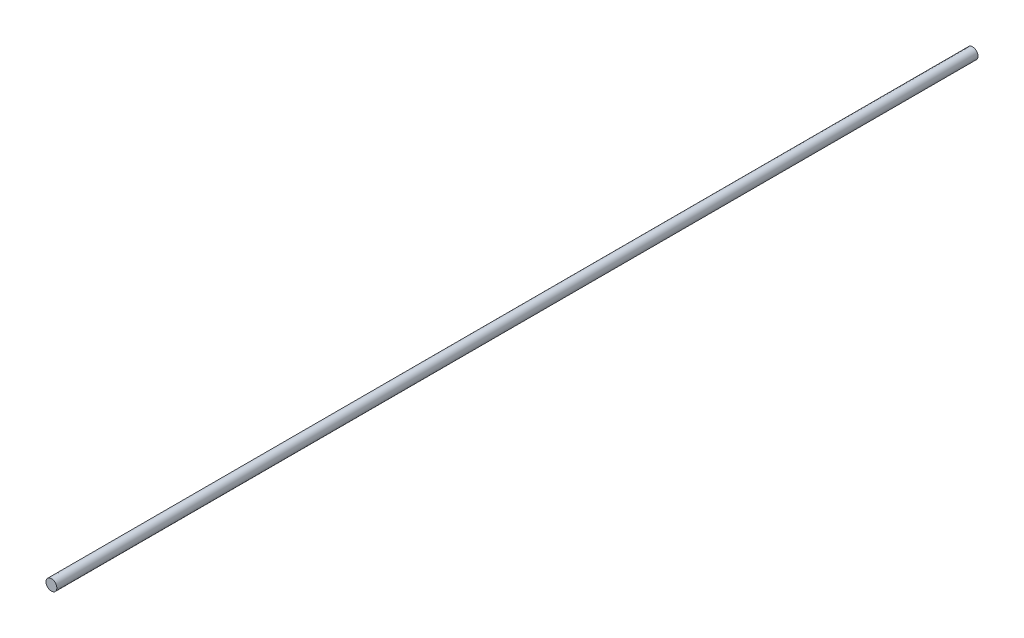
ISO-10303-21;
HEADER;
FILE_DESCRIPTION(('STEP AP214'),'2;1');
FILE_NAME('part.step','',(''),(''),'','','');
FILE_SCHEMA(('AUTOMOTIVE_DESIGN { 1 0 10303 214 1 1 1 1 }'));
ENDSEC;
DATA;
#1=APPLICATION_CONTEXT('core data for automotive mechanical design processes');
#2=APPLICATION_PROTOCOL_DEFINITION('international standard','automotive_design',2000,#1);
#3=PRODUCT_CONTEXT('',#1,'mechanical');
#4=PRODUCT('Part','Part','',(#3));
#5=PRODUCT_RELATED_PRODUCT_CATEGORY('part','',(#4));
#6=PRODUCT_DEFINITION_FORMATION('','',#4);
#7=PRODUCT_DEFINITION_CONTEXT('part definition',#1,'design');
#8=PRODUCT_DEFINITION('design','',#6,#7);
#9=PRODUCT_DEFINITION_SHAPE('','',#8);
#10=(LENGTH_UNIT() NAMED_UNIT(*) SI_UNIT(.MILLI.,.METRE.));
#11=(NAMED_UNIT(*) PLANE_ANGLE_UNIT() SI_UNIT($,.RADIAN.));
#12=(NAMED_UNIT(*) SI_UNIT($,.STERADIAN.) SOLID_ANGLE_UNIT());
#13=UNCERTAINTY_MEASURE_WITH_UNIT(LENGTH_MEASURE(1.E-05),#10,'distance_accuracy_value','');
#14=(GEOMETRIC_REPRESENTATION_CONTEXT(3) GLOBAL_UNCERTAINTY_ASSIGNED_CONTEXT((#13)) GLOBAL_UNIT_ASSIGNED_CONTEXT((#10,
#11,#12)) REPRESENTATION_CONTEXT('',''));
#15=CARTESIAN_POINT('',(0.,0.,0.));
#16=DIRECTION('',(0.,0.,1.));
#17=DIRECTION('',(1.,0.,0.));
#18=AXIS2_PLACEMENT_3D('',#15,#16,#17);
#19=CARTESIAN_POINT('',(0.,0.,255.));
#20=DIRECTION('',(0.,0.,-1.));
#21=DIRECTION('',(-1.,0.,0.));
#22=AXIS2_PLACEMENT_3D('',#19,#20,#21);
#23=CYLINDRICAL_SURFACE('',#22,1.5);
#24=CARTESIAN_POINT('',(0.,0.,255.));
#25=DIRECTION('',(0.,0.,1.));
#26=DIRECTION('',(1.,0.,0.));
#27=AXIS2_PLACEMENT_3D('',#24,#25,#26);
#28=CIRCLE('',#27,1.5);
#29=CARTESIAN_POINT('',(1.5,0.,255.));
#30=VERTEX_POINT('',#29);
#31=EDGE_CURVE('E10',#30,#30,#28,.T.);
#32=ORIENTED_EDGE('',*,*,#31,.F.);
#33=EDGE_LOOP('',(#32));
#34=FACE_BOUND('',#33,.T.);
#35=CARTESIAN_POINT('',(0.,0.,0.));
#36=DIRECTION('',(0.,0.,1.));
#37=DIRECTION('',(1.,0.,0.));
#38=AXIS2_PLACEMENT_3D('',#35,#36,#37);
#39=CIRCLE('',#38,1.5);
#40=CARTESIAN_POINT('',(1.5,0.,0.));
#41=VERTEX_POINT('',#40);
#42=EDGE_CURVE('E33',#41,#41,#39,.T.);
#43=ORIENTED_EDGE('',*,*,#42,.T.);
#44=EDGE_LOOP('',(#43));
#45=FACE_BOUND('',#44,.T.);
#46=ADVANCED_FACE('F30',(#34,#45),#23,.T.);
#47=CARTESIAN_POINT('',(0.,0.,255.));
#48=DIRECTION('',(0.,0.,1.));
#49=DIRECTION('',(1.,0.,0.));
#50=AXIS2_PLACEMENT_3D('',#47,#48,#49);
#51=PLANE('',#50);
#52=ORIENTED_EDGE('',*,*,#31,.T.);
#53=EDGE_LOOP('',(#52));
#54=FACE_BOUND('',#53,.T.);
#55=ADVANCED_FACE('F45',(#54),#51,.T.);
#56=CARTESIAN_POINT('',(0.,0.,0.));
#57=DIRECTION('',(0.,0.,1.));
#58=DIRECTION('',(1.,0.,0.));
#59=AXIS2_PLACEMENT_3D('',#56,#57,#58);
#60=PLANE('',#59);
#61=ORIENTED_EDGE('',*,*,#42,.F.);
#62=EDGE_LOOP('',(#61));
#63=FACE_BOUND('',#62,.T.);
#64=ADVANCED_FACE('F43',(#63),#60,.F.);
#65=CLOSED_SHELL('',(#46,#55,#64));
#66=MANIFOLD_SOLID_BREP('B2',#65);
#67=ADVANCED_BREP_SHAPE_REPRESENTATION('',(#18,#66),#14);
#68=SHAPE_DEFINITION_REPRESENTATION(#9,#67);
ENDSEC;
END-ISO-10303-21;
